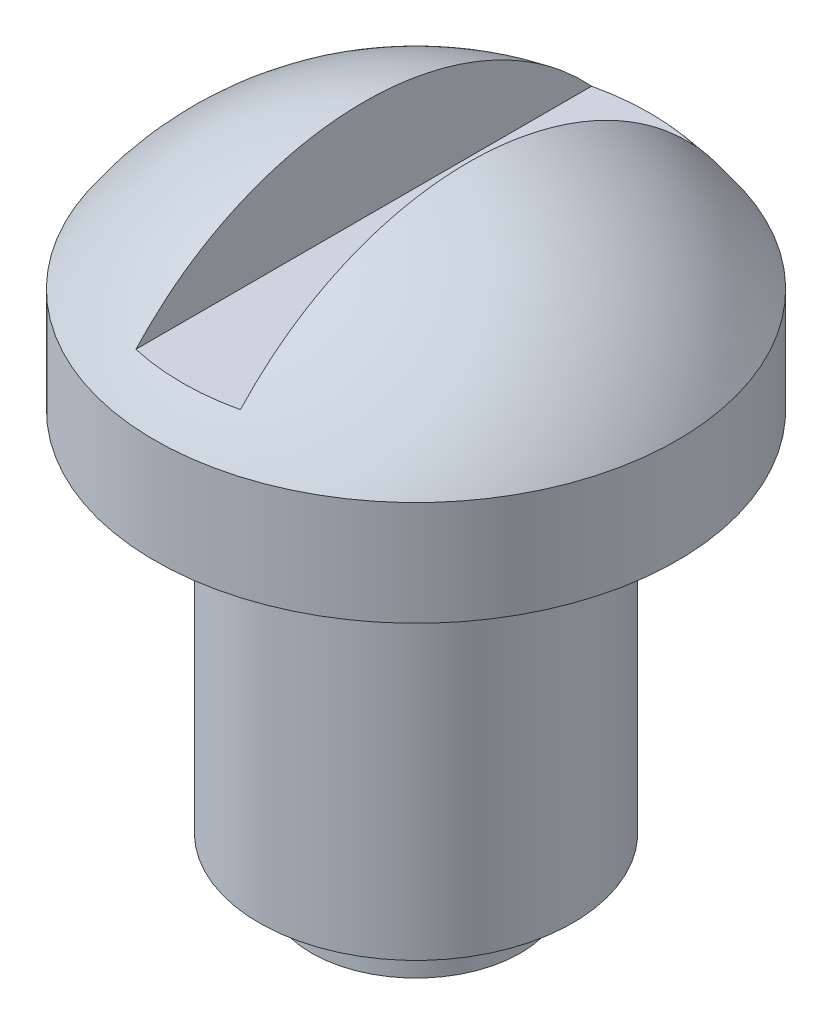
ISO-10303-21;
HEADER;
FILE_DESCRIPTION(('STEP AP214'),'2;1');
FILE_NAME('part.step','',(''),(''),'','','');
FILE_SCHEMA(('AUTOMOTIVE_DESIGN { 1 0 10303 214 1 1 1 1 }'));
ENDSEC;
DATA;
#1=APPLICATION_CONTEXT('core data for automotive mechanical design processes');
#2=APPLICATION_PROTOCOL_DEFINITION('international standard','automotive_design',2000,#1);
#3=PRODUCT_CONTEXT('',#1,'mechanical');
#4=PRODUCT('Part','Part','',(#3));
#5=PRODUCT_RELATED_PRODUCT_CATEGORY('part','',(#4));
#6=PRODUCT_DEFINITION_FORMATION('','',#4);
#7=PRODUCT_DEFINITION_CONTEXT('part definition',#1,'design');
#8=PRODUCT_DEFINITION('design','',#6,#7);
#9=PRODUCT_DEFINITION_SHAPE('','',#8);
#10=(LENGTH_UNIT() NAMED_UNIT(*) SI_UNIT(.MILLI.,.METRE.));
#11=(NAMED_UNIT(*) PLANE_ANGLE_UNIT() SI_UNIT($,.RADIAN.));
#12=(NAMED_UNIT(*) SI_UNIT($,.STERADIAN.) SOLID_ANGLE_UNIT());
#13=UNCERTAINTY_MEASURE_WITH_UNIT(LENGTH_MEASURE(1.E-05),#10,'distance_accuracy_value','');
#14=(GEOMETRIC_REPRESENTATION_CONTEXT(3) GLOBAL_UNCERTAINTY_ASSIGNED_CONTEXT((#13)) GLOBAL_UNIT_ASSIGNED_CONTEXT((#10,
#11,#12)) REPRESENTATION_CONTEXT('',''));
#15=CARTESIAN_POINT('',(0.,0.,0.));
#16=DIRECTION('',(0.,0.,1.));
#17=DIRECTION('',(1.,0.,0.));
#18=AXIS2_PLACEMENT_3D('',#15,#16,#17);
#19=CARTESIAN_POINT('',(0.,0.,0.));
#20=DIRECTION('',(0.,1.,0.));
#21=DIRECTION('',(-1.,0.,0.));
#22=AXIS2_PLACEMENT_3D('',#19,#20,#21);
#23=PLANE('',#22);
#24=CARTESIAN_POINT('',(0.,0.,0.));
#25=DIRECTION('',(0.,1.,0.));
#26=DIRECTION('',(-1.,0.,0.));
#27=AXIS2_PLACEMENT_3D('',#24,#25,#26);
#28=CIRCLE('',#27,2.);
#29=CARTESIAN_POINT('',(-2.,0.,0.));
#30=VERTEX_POINT('',#29);
#31=EDGE_CURVE('E86',#30,#30,#28,.T.);
#32=ORIENTED_EDGE('',*,*,#31,.F.);
#33=EDGE_LOOP('',(#32));
#34=FACE_BOUND('',#33,.T.);
#35=ADVANCED_FACE('F33',(#34),#23,.F.);
#36=CARTESIAN_POINT('',(0.,6.6833752096446,0.));
#37=DIRECTION('',(0.,1.,0.));
#38=DIRECTION('',(1.,0.,0.));
#39=AXIS2_PLACEMENT_3D('',#36,#37,#38);
#40=SPHERICAL_SURFACE('',#39,6.);
#41=CARTESIAN_POINT('',(0.,10.6833752096446,0.));
#42=DIRECTION('',(0.,-1.,0.));
#43=DIRECTION('',(0.,0.,-1.));
#44=AXIS2_PLACEMENT_3D('',#41,#42,#43);
#45=CIRCLE('',#44,4.47213595499958);
#46=CARTESIAN_POINT('',(-0.999999999999998,10.6833752096446,-4.35889894354067));
#47=VERTEX_POINT('',#46);
#48=CARTESIAN_POINT('',(0.999999999999998,10.6833752096446,-4.35889894354067));
#49=VERTEX_POINT('',#48);
#50=EDGE_CURVE('E63',#47,#49,#45,.T.);
#51=ORIENTED_EDGE('',*,*,#50,.T.);
#52=CARTESIAN_POINT('',(0.99999999999999,6.6833752096446,0.));
#53=DIRECTION('',(1.,0.,0.));
#54=DIRECTION('',(0.,1.,0.));
#55=AXIS2_PLACEMENT_3D('',#52,#53,#54);
#56=CIRCLE('',#55,5.91607978309962);
#57=CARTESIAN_POINT('',(0.999999999999998,10.6833752096446,4.35889894354067));
#58=VERTEX_POINT('',#57);
#59=EDGE_CURVE('E11',#49,#58,#56,.T.);
#60=ORIENTED_EDGE('',*,*,#59,.T.);
#61=CARTESIAN_POINT('',(-0.999999999999998,10.6833752096446,4.35889894354067));
#62=VERTEX_POINT('',#61);
#63=EDGE_CURVE('E40',#58,#62,#45,.T.);
#64=ORIENTED_EDGE('',*,*,#63,.T.);
#65=CARTESIAN_POINT('',(-0.999999999999999,6.6833752096446,0.));
#66=DIRECTION('',(-1.,0.,0.));
#67=DIRECTION('',(0.,-1.,0.));
#68=AXIS2_PLACEMENT_3D('',#65,#66,#67);
#69=CIRCLE('',#68,5.91607978309962);
#70=EDGE_CURVE('E59',#62,#47,#69,.T.);
#71=ORIENTED_EDGE('',*,*,#70,.T.);
#72=EDGE_LOOP('',(#51,#60,#64,#71));
#73=FACE_BOUND('',#72,.T.);
#74=CARTESIAN_POINT('',(0.,10.,0.));
#75=DIRECTION('',(0.,1.,0.));
#76=DIRECTION('',(-1.,0.,0.));
#77=AXIS2_PLACEMENT_3D('',#74,#75,#76);
#78=CIRCLE('',#77,5.);
#79=CARTESIAN_POINT('',(-5.,10.,0.));
#80=VERTEX_POINT('',#79);
#81=EDGE_CURVE('E64',#80,#80,#78,.T.);
#82=ORIENTED_EDGE('',*,*,#81,.T.);
#83=EDGE_LOOP('',(#82));
#84=FACE_BOUND('',#83,.T.);
#85=ADVANCED_FACE('F69',(#73,#84),#40,.T.);
#86=CARTESIAN_POINT('',(0.,12.6833752096446,0.));
#87=DIRECTION('',(0.,1.,0.));
#88=DIRECTION('',(-1.,0.,0.));
#89=AXIS2_PLACEMENT_3D('',#86,#87,#88);
#90=CYLINDRICAL_SURFACE('',#89,5.);
#91=ORIENTED_EDGE('',*,*,#81,.F.);
#92=EDGE_LOOP('',(#91));
#93=FACE_BOUND('',#92,.T.);
#94=CARTESIAN_POINT('',(0.,8.,0.));
#95=DIRECTION('',(0.,1.,0.));
#96=DIRECTION('',(-1.,0.,0.));
#97=AXIS2_PLACEMENT_3D('',#94,#95,#96);
#98=CIRCLE('',#97,5.);
#99=CARTESIAN_POINT('',(-5.,8.,0.));
#100=VERTEX_POINT('',#99);
#101=EDGE_CURVE('E74',#100,#100,#98,.T.);
#102=ORIENTED_EDGE('',*,*,#101,.T.);
#103=EDGE_LOOP('',(#102));
#104=FACE_BOUND('',#103,.T.);
#105=ADVANCED_FACE('F108',(#93,#104),#90,.T.);
#106=CARTESIAN_POINT('',(3.,8.,0.));
#107=DIRECTION('',(0.,1.,0.));
#108=DIRECTION('',(-1.,0.,0.));
#109=AXIS2_PLACEMENT_3D('',#106,#107,#108);
#110=PLANE('',#109);
#111=ORIENTED_EDGE('',*,*,#101,.F.);
#112=EDGE_LOOP('',(#111));
#113=FACE_BOUND('',#112,.T.);
#114=CARTESIAN_POINT('',(0.,8.,0.));
#115=DIRECTION('',(0.,1.,0.));
#116=DIRECTION('',(-1.,0.,0.));
#117=AXIS2_PLACEMENT_3D('',#114,#115,#116);
#118=CIRCLE('',#117,3.);
#119=CARTESIAN_POINT('',(-3.,8.,0.));
#120=VERTEX_POINT('',#119);
#121=EDGE_CURVE('E77',#120,#120,#118,.T.);
#122=ORIENTED_EDGE('',*,*,#121,.T.);
#123=EDGE_LOOP('',(#122));
#124=FACE_BOUND('',#123,.T.);
#125=ADVANCED_FACE('F114',(#113,#124),#110,.F.);
#126=CARTESIAN_POINT('',(0.,12.6833752096446,0.));
#127=DIRECTION('',(0.,1.,0.));
#128=DIRECTION('',(-1.,0.,0.));
#129=AXIS2_PLACEMENT_3D('',#126,#127,#128);
#130=CYLINDRICAL_SURFACE('',#129,3.);
#131=ORIENTED_EDGE('',*,*,#121,.F.);
#132=EDGE_LOOP('',(#131));
#133=FACE_BOUND('',#132,.T.);
#134=CARTESIAN_POINT('',(0.,1.,0.));
#135=DIRECTION('',(0.,1.,0.));
#136=DIRECTION('',(-1.,0.,0.));
#137=AXIS2_PLACEMENT_3D('',#134,#135,#136);
#138=CIRCLE('',#137,3.);
#139=CARTESIAN_POINT('',(-3.,1.,0.));
#140=VERTEX_POINT('',#139);
#141=EDGE_CURVE('E80',#140,#140,#138,.T.);
#142=ORIENTED_EDGE('',*,*,#141,.T.);
#143=EDGE_LOOP('',(#142));
#144=FACE_BOUND('',#143,.T.);
#145=ADVANCED_FACE('F120',(#133,#144),#130,.T.);
#146=CARTESIAN_POINT('',(2.,1.,0.));
#147=DIRECTION('',(0.,1.,0.));
#148=DIRECTION('',(-1.,0.,0.));
#149=AXIS2_PLACEMENT_3D('',#146,#147,#148);
#150=PLANE('',#149);
#151=ORIENTED_EDGE('',*,*,#141,.F.);
#152=EDGE_LOOP('',(#151));
#153=FACE_BOUND('',#152,.T.);
#154=CARTESIAN_POINT('',(0.,1.,0.));
#155=DIRECTION('',(0.,1.,0.));
#156=DIRECTION('',(-1.,0.,0.));
#157=AXIS2_PLACEMENT_3D('',#154,#155,#156);
#158=CIRCLE('',#157,2.);
#159=CARTESIAN_POINT('',(-2.,1.,0.));
#160=VERTEX_POINT('',#159);
#161=EDGE_CURVE('E83',#160,#160,#158,.T.);
#162=ORIENTED_EDGE('',*,*,#161,.T.);
#163=EDGE_LOOP('',(#162));
#164=FACE_BOUND('',#163,.T.);
#165=ADVANCED_FACE('F99',(#153,#164),#150,.F.);
#166=CARTESIAN_POINT('',(0.,12.6833752096446,0.));
#167=DIRECTION('',(0.,1.,0.));
#168=DIRECTION('',(-1.,0.,0.));
#169=AXIS2_PLACEMENT_3D('',#166,#167,#168);
#170=CYLINDRICAL_SURFACE('',#169,2.);
#171=ORIENTED_EDGE('',*,*,#161,.F.);
#172=EDGE_LOOP('',(#171));
#173=FACE_BOUND('',#172,.T.);
#174=ORIENTED_EDGE('',*,*,#31,.T.);
#175=EDGE_LOOP('',(#174));
#176=FACE_BOUND('',#175,.T.);
#177=ADVANCED_FACE('F92',(#173,#176),#170,.T.);
#178=CARTESIAN_POINT('',(0.999999999999998,10.6833752096446,-5.));
#179=DIRECTION('',(1.,0.,0.));
#180=DIRECTION('',(0.,1.,0.));
#181=AXIS2_PLACEMENT_3D('',#178,#179,#180);
#182=PLANE('',#181);
#183=DIRECTION('',(0.,0.,1.));
#184=VECTOR('',#183,1.);
#185=CARTESIAN_POINT('',(0.999999999999998,10.6833752096446,-5.));
#186=LINE('',#185,#184);
#187=EDGE_CURVE('E67',#49,#58,#186,.T.);
#188=ORIENTED_EDGE('',*,*,#187,.T.);
#189=ORIENTED_EDGE('',*,*,#59,.F.);
#190=EDGE_LOOP('',(#188,#189));
#191=FACE_BOUND('',#190,.T.);
#192=ADVANCED_FACE('F90',(#191),#182,.F.);
#193=CARTESIAN_POINT('',(-0.999999999999998,10.6833752096446,-5.));
#194=DIRECTION('',(0.,-1.,0.));
#195=DIRECTION('',(0.,0.,-1.));
#196=AXIS2_PLACEMENT_3D('',#193,#194,#195);
#197=PLANE('',#196);
#198=ORIENTED_EDGE('',*,*,#187,.F.);
#199=ORIENTED_EDGE('',*,*,#50,.F.);
#200=DIRECTION('',(0.,0.,1.));
#201=VECTOR('',#200,1.);
#202=CARTESIAN_POINT('',(-0.999999999999998,10.6833752096446,-5.));
#203=LINE('',#202,#201);
#204=EDGE_CURVE('E46',#47,#62,#203,.T.);
#205=ORIENTED_EDGE('',*,*,#204,.T.);
#206=ORIENTED_EDGE('',*,*,#63,.F.);
#207=EDGE_LOOP('',(#198,#199,#205,#206));
#208=FACE_BOUND('',#207,.T.);
#209=ADVANCED_FACE('F66',(#208),#197,.F.);
#210=CARTESIAN_POINT('',(-0.999999999999998,12.6833752096446,-5.));
#211=DIRECTION('',(-1.,0.,0.));
#212=DIRECTION('',(0.,-1.,0.));
#213=AXIS2_PLACEMENT_3D('',#210,#211,#212);
#214=PLANE('',#213);
#215=ORIENTED_EDGE('',*,*,#204,.F.);
#216=ORIENTED_EDGE('',*,*,#70,.F.);
#217=EDGE_LOOP('',(#215,#216));
#218=FACE_BOUND('',#217,.T.);
#219=ADVANCED_FACE('F60',(#218),#214,.F.);
#220=CLOSED_SHELL('',(#35,#85,#105,#125,#145,#165,#177,#192,#209,#219));
#221=MANIFOLD_SOLID_BREP('B2',#220);
#222=ADVANCED_BREP_SHAPE_REPRESENTATION('',(#18,#221),#14);
#223=SHAPE_DEFINITION_REPRESENTATION(#9,#222);
ENDSEC;
END-ISO-10303-21;
